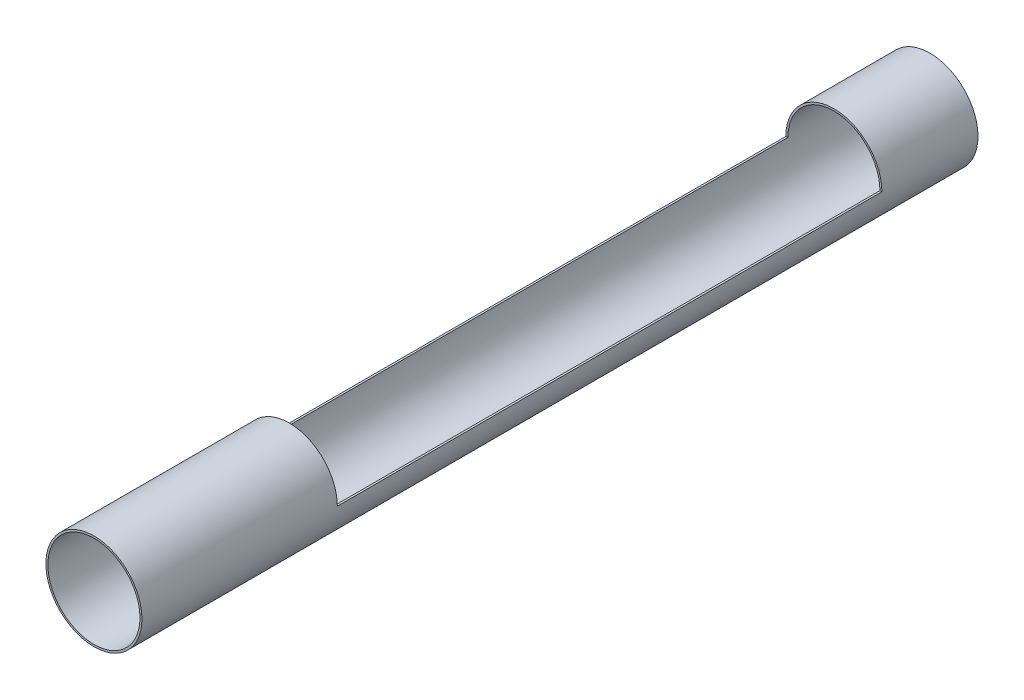
ISO-10303-21;
HEADER;
FILE_DESCRIPTION(('STEP AP214'),'2;1');
FILE_NAME('part.step','',(''),(''),'','','');
FILE_SCHEMA(('AUTOMOTIVE_DESIGN { 1 0 10303 214 1 1 1 1 }'));
ENDSEC;
DATA;
#1=APPLICATION_CONTEXT('core data for automotive mechanical design processes');
#2=APPLICATION_PROTOCOL_DEFINITION('international standard','automotive_design',2000,#1);
#3=PRODUCT_CONTEXT('',#1,'mechanical');
#4=PRODUCT('Part','Part','',(#3));
#5=PRODUCT_RELATED_PRODUCT_CATEGORY('part','',(#4));
#6=PRODUCT_DEFINITION_FORMATION('','',#4);
#7=PRODUCT_DEFINITION_CONTEXT('part definition',#1,'design');
#8=PRODUCT_DEFINITION('design','',#6,#7);
#9=PRODUCT_DEFINITION_SHAPE('','',#8);
#10=(LENGTH_UNIT() NAMED_UNIT(*) SI_UNIT(.MILLI.,.METRE.));
#11=(NAMED_UNIT(*) PLANE_ANGLE_UNIT() SI_UNIT($,.RADIAN.));
#12=(NAMED_UNIT(*) SI_UNIT($,.STERADIAN.) SOLID_ANGLE_UNIT());
#13=UNCERTAINTY_MEASURE_WITH_UNIT(LENGTH_MEASURE(1.E-05),#10,'distance_accuracy_value','');
#14=(GEOMETRIC_REPRESENTATION_CONTEXT(3) GLOBAL_UNCERTAINTY_ASSIGNED_CONTEXT((#13)) GLOBAL_UNIT_ASSIGNED_CONTEXT((#10,
#11,#12)) REPRESENTATION_CONTEXT('',''));
#15=CARTESIAN_POINT('',(0.,0.,0.));
#16=DIRECTION('',(0.,0.,1.));
#17=DIRECTION('',(1.,0.,0.));
#18=AXIS2_PLACEMENT_3D('',#15,#16,#17);
#19=CARTESIAN_POINT('',(0.,0.,76.2));
#20=DIRECTION('',(0.,0.,1.));
#21=DIRECTION('',(1.,0.,0.));
#22=AXIS2_PLACEMENT_3D('',#19,#20,#21);
#23=PLANE('',#22);
#24=DIRECTION('',(-1.,0.,0.));
#25=VECTOR('',#24,1.);
#26=CARTESIAN_POINT('',(-38.0746,0.,76.2));
#27=LINE('',#26,#25);
#28=CARTESIAN_POINT('',(-36.5125,0.,76.2));
#29=VERTEX_POINT('',#28);
#30=CARTESIAN_POINT('',(-38.0746,0.,76.2));
#31=VERTEX_POINT('',#30);
#32=EDGE_CURVE('E49',#29,#31,#27,.T.);
#33=ORIENTED_EDGE('',*,*,#32,.F.);
#34=CARTESIAN_POINT('',(0.,0.,76.2));
#35=DIRECTION('',(0.,0.,1.));
#36=DIRECTION('',(1.,0.,0.));
#37=AXIS2_PLACEMENT_3D('',#34,#35,#36);
#38=CIRCLE('',#37,36.5125);
#39=CARTESIAN_POINT('',(36.5125,0.,76.2));
#40=VERTEX_POINT('',#39);
#41=EDGE_CURVE('E115',#40,#29,#38,.T.);
#42=ORIENTED_EDGE('',*,*,#41,.F.);
#43=DIRECTION('',(-1.,0.,0.));
#44=VECTOR('',#43,1.);
#45=CARTESIAN_POINT('',(38.0746,0.,76.2));
#46=LINE('',#45,#44);
#47=CARTESIAN_POINT('',(38.0746,0.,76.2));
#48=VERTEX_POINT('',#47);
#49=EDGE_CURVE('E99',#48,#40,#46,.T.);
#50=ORIENTED_EDGE('',*,*,#49,.F.);
#51=CARTESIAN_POINT('',(0.,0.,76.2));
#52=DIRECTION('',(0.,0.,1.));
#53=DIRECTION('',(1.,0.,0.));
#54=AXIS2_PLACEMENT_3D('',#51,#52,#53);
#55=CIRCLE('',#54,38.0746);
#56=EDGE_CURVE('E11',#48,#31,#55,.T.);
#57=ORIENTED_EDGE('',*,*,#56,.T.);
#58=EDGE_LOOP('',(#33,#42,#50,#57));
#59=FACE_BOUND('',#58,.T.);
#60=ADVANCED_FACE('F35',(#59),#23,.T.);
#61=CARTESIAN_POINT('',(0.,0.,0.));
#62=DIRECTION('',(0.,0.,1.));
#63=DIRECTION('',(1.,0.,0.));
#64=AXIS2_PLACEMENT_3D('',#61,#62,#63);
#65=PLANE('',#64);
#66=CARTESIAN_POINT('',(0.,0.,0.));
#67=DIRECTION('',(0.,0.,1.));
#68=DIRECTION('',(1.,0.,0.));
#69=AXIS2_PLACEMENT_3D('',#66,#67,#68);
#70=CIRCLE('',#69,38.0746);
#71=CARTESIAN_POINT('',(38.0746,0.,0.));
#72=VERTEX_POINT('',#71);
#73=EDGE_CURVE('E39',#72,#72,#70,.T.);
#74=ORIENTED_EDGE('',*,*,#73,.F.);
#75=EDGE_LOOP('',(#74));
#76=FACE_BOUND('',#75,.T.);
#77=CARTESIAN_POINT('',(0.,0.,0.));
#78=DIRECTION('',(0.,0.,1.));
#79=DIRECTION('',(1.,0.,0.));
#80=AXIS2_PLACEMENT_3D('',#77,#78,#79);
#81=CIRCLE('',#80,36.5125);
#82=CARTESIAN_POINT('',(36.5125,0.,0.));
#83=VERTEX_POINT('',#82);
#84=EDGE_CURVE('E114',#83,#83,#81,.T.);
#85=ORIENTED_EDGE('',*,*,#84,.T.);
#86=EDGE_LOOP('',(#85));
#87=FACE_BOUND('',#86,.T.);
#88=ADVANCED_FACE('F120',(#76,#87),#65,.F.);
#89=CARTESIAN_POINT('',(0.,0.,76.2));
#90=DIRECTION('',(0.,0.,-1.));
#91=DIRECTION('',(-1.,0.,0.));
#92=AXIS2_PLACEMENT_3D('',#89,#90,#91);
#93=CYLINDRICAL_SURFACE('',#92,38.0746);
#94=ORIENTED_EDGE('',*,*,#56,.F.);
#95=DIRECTION('',(0.,0.,-1.));
#96=VECTOR('',#95,1.);
#97=CARTESIAN_POINT('',(38.0746,0.,508.));
#98=LINE('',#97,#96);
#99=CARTESIAN_POINT('',(38.0746,0.,508.));
#100=VERTEX_POINT('',#99);
#101=EDGE_CURVE('E94',#100,#48,#98,.T.);
#102=ORIENTED_EDGE('',*,*,#101,.F.);
#103=CARTESIAN_POINT('',(0.,0.,508.));
#104=DIRECTION('',(0.,0.,1.));
#105=DIRECTION('',(1.,0.,0.));
#106=AXIS2_PLACEMENT_3D('',#103,#104,#105);
#107=CIRCLE('',#106,38.0746);
#108=CARTESIAN_POINT('',(-38.0746,0.,508.));
#109=VERTEX_POINT('',#108);
#110=EDGE_CURVE('E86',#100,#109,#107,.T.);
#111=ORIENTED_EDGE('',*,*,#110,.T.);
#112=DIRECTION('',(0.,0.,-1.));
#113=VECTOR('',#112,1.);
#114=CARTESIAN_POINT('',(-38.0746,0.,508.));
#115=LINE('',#114,#113);
#116=EDGE_CURVE('E72',#109,#31,#115,.T.);
#117=ORIENTED_EDGE('',*,*,#116,.T.);
#118=EDGE_LOOP('',(#94,#102,#111,#117));
#119=FACE_BOUND('',#118,.T.);
#120=ORIENTED_EDGE('',*,*,#73,.T.);
#121=EDGE_LOOP('',(#120));
#122=FACE_BOUND('',#121,.T.);
#123=CARTESIAN_POINT('',(0.,0.,662.94));
#124=DIRECTION('',(0.,0.,1.));
#125=DIRECTION('',(1.,0.,0.));
#126=AXIS2_PLACEMENT_3D('',#123,#124,#125);
#127=CIRCLE('',#126,38.0746);
#128=CARTESIAN_POINT('',(38.0746,0.,662.94));
#129=VERTEX_POINT('',#128);
#130=EDGE_CURVE('E95',#129,#129,#127,.T.);
#131=ORIENTED_EDGE('',*,*,#130,.F.);
#132=EDGE_LOOP('',(#131));
#133=FACE_BOUND('',#132,.T.);
#134=ADVANCED_FACE('F37',(#119,#122,#133),#93,.T.);
#135=CARTESIAN_POINT('',(0.,0.,76.2));
#136=DIRECTION('',(0.,0.,-1.));
#137=DIRECTION('',(-1.,0.,0.));
#138=AXIS2_PLACEMENT_3D('',#135,#136,#137);
#139=CYLINDRICAL_SURFACE('',#138,36.5125);
#140=ORIENTED_EDGE('',*,*,#41,.T.);
#141=DIRECTION('',(0.,0.,-1.));
#142=VECTOR('',#141,1.);
#143=CARTESIAN_POINT('',(-36.5125,0.,508.));
#144=LINE('',#143,#142);
#145=CARTESIAN_POINT('',(-36.5125,0.,508.));
#146=VERTEX_POINT('',#145);
#147=EDGE_CURVE('E80',#146,#29,#144,.T.);
#148=ORIENTED_EDGE('',*,*,#147,.F.);
#149=CARTESIAN_POINT('',(0.,0.,508.));
#150=DIRECTION('',(0.,0.,1.));
#151=DIRECTION('',(1.,0.,0.));
#152=AXIS2_PLACEMENT_3D('',#149,#150,#151);
#153=CIRCLE('',#152,36.5125);
#154=CARTESIAN_POINT('',(36.5125,0.,508.));
#155=VERTEX_POINT('',#154);
#156=EDGE_CURVE('E88',#155,#146,#153,.T.);
#157=ORIENTED_EDGE('',*,*,#156,.F.);
#158=DIRECTION('',(0.,0.,-1.));
#159=VECTOR('',#158,1.);
#160=CARTESIAN_POINT('',(36.5125,0.,508.));
#161=LINE('',#160,#159);
#162=EDGE_CURVE('E110',#155,#40,#161,.T.);
#163=ORIENTED_EDGE('',*,*,#162,.T.);
#164=EDGE_LOOP('',(#140,#148,#157,#163));
#165=FACE_BOUND('',#164,.T.);
#166=ORIENTED_EDGE('',*,*,#84,.F.);
#167=EDGE_LOOP('',(#166));
#168=FACE_BOUND('',#167,.T.);
#169=CARTESIAN_POINT('',(0.,0.,662.94));
#170=DIRECTION('',(0.,0.,1.));
#171=DIRECTION('',(1.,0.,0.));
#172=AXIS2_PLACEMENT_3D('',#169,#170,#171);
#173=CIRCLE('',#172,36.5125);
#174=CARTESIAN_POINT('',(36.5125,0.,662.94));
#175=VERTEX_POINT('',#174);
#176=EDGE_CURVE('E96',#175,#175,#173,.T.);
#177=ORIENTED_EDGE('',*,*,#176,.T.);
#178=EDGE_LOOP('',(#177));
#179=FACE_BOUND('',#178,.T.);
#180=ADVANCED_FACE('F122',(#165,#168,#179),#139,.F.);
#181=CARTESIAN_POINT('',(38.0746,0.,508.));
#182=DIRECTION('',(0.,-1.,0.));
#183=DIRECTION('',(0.,0.,-1.));
#184=AXIS2_PLACEMENT_3D('',#181,#182,#183);
#185=PLANE('',#184);
#186=ORIENTED_EDGE('',*,*,#49,.T.);
#187=ORIENTED_EDGE('',*,*,#162,.F.);
#188=DIRECTION('',(-1.,0.,0.));
#189=VECTOR('',#188,1.);
#190=CARTESIAN_POINT('',(38.0746,0.,508.));
#191=LINE('',#190,#189);
#192=EDGE_CURVE('E89',#100,#155,#191,.T.);
#193=ORIENTED_EDGE('',*,*,#192,.F.);
#194=ORIENTED_EDGE('',*,*,#101,.T.);
#195=EDGE_LOOP('',(#186,#187,#193,#194));
#196=FACE_BOUND('',#195,.T.);
#197=ADVANCED_FACE('F125',(#196),#185,.F.);
#198=CARTESIAN_POINT('',(-38.0746,0.,508.));
#199=DIRECTION('',(0.,-1.,0.));
#200=DIRECTION('',(0.,0.,-1.));
#201=AXIS2_PLACEMENT_3D('',#198,#199,#200);
#202=PLANE('',#201);
#203=ORIENTED_EDGE('',*,*,#32,.T.);
#204=ORIENTED_EDGE('',*,*,#116,.F.);
#205=DIRECTION('',(-1.,0.,0.));
#206=VECTOR('',#205,1.);
#207=CARTESIAN_POINT('',(-38.0746,0.,508.));
#208=LINE('',#207,#206);
#209=EDGE_CURVE('E76',#146,#109,#208,.T.);
#210=ORIENTED_EDGE('',*,*,#209,.F.);
#211=ORIENTED_EDGE('',*,*,#147,.T.);
#212=EDGE_LOOP('',(#203,#204,#210,#211));
#213=FACE_BOUND('',#212,.T.);
#214=ADVANCED_FACE('F74',(#213),#202,.F.);
#215=CARTESIAN_POINT('',(0.,0.,508.));
#216=DIRECTION('',(0.,0.,1.));
#217=DIRECTION('',(1.,0.,0.));
#218=AXIS2_PLACEMENT_3D('',#215,#216,#217);
#219=PLANE('',#218);
#220=ORIENTED_EDGE('',*,*,#110,.F.);
#221=ORIENTED_EDGE('',*,*,#192,.T.);
#222=ORIENTED_EDGE('',*,*,#156,.T.);
#223=ORIENTED_EDGE('',*,*,#209,.T.);
#224=EDGE_LOOP('',(#220,#221,#222,#223));
#225=FACE_BOUND('',#224,.T.);
#226=ADVANCED_FACE('F84',(#225),#219,.F.);
#227=CARTESIAN_POINT('',(0.,0.,662.94));
#228=DIRECTION('',(0.,0.,1.));
#229=DIRECTION('',(1.,0.,0.));
#230=AXIS2_PLACEMENT_3D('',#227,#228,#229);
#231=PLANE('',#230);
#232=ORIENTED_EDGE('',*,*,#130,.T.);
#233=EDGE_LOOP('',(#232));
#234=FACE_BOUND('',#233,.T.);
#235=ORIENTED_EDGE('',*,*,#176,.F.);
#236=EDGE_LOOP('',(#235));
#237=FACE_BOUND('',#236,.T.);
#238=ADVANCED_FACE('F130',(#234,#237),#231,.T.);
#239=CLOSED_SHELL('',(#60,#88,#134,#180,#197,#214,#226,#238));
#240=MANIFOLD_SOLID_BREP('B2',#239);
#241=ADVANCED_BREP_SHAPE_REPRESENTATION('',(#18,#240),#14);
#242=SHAPE_DEFINITION_REPRESENTATION(#9,#241);
ENDSEC;
END-ISO-10303-21;
